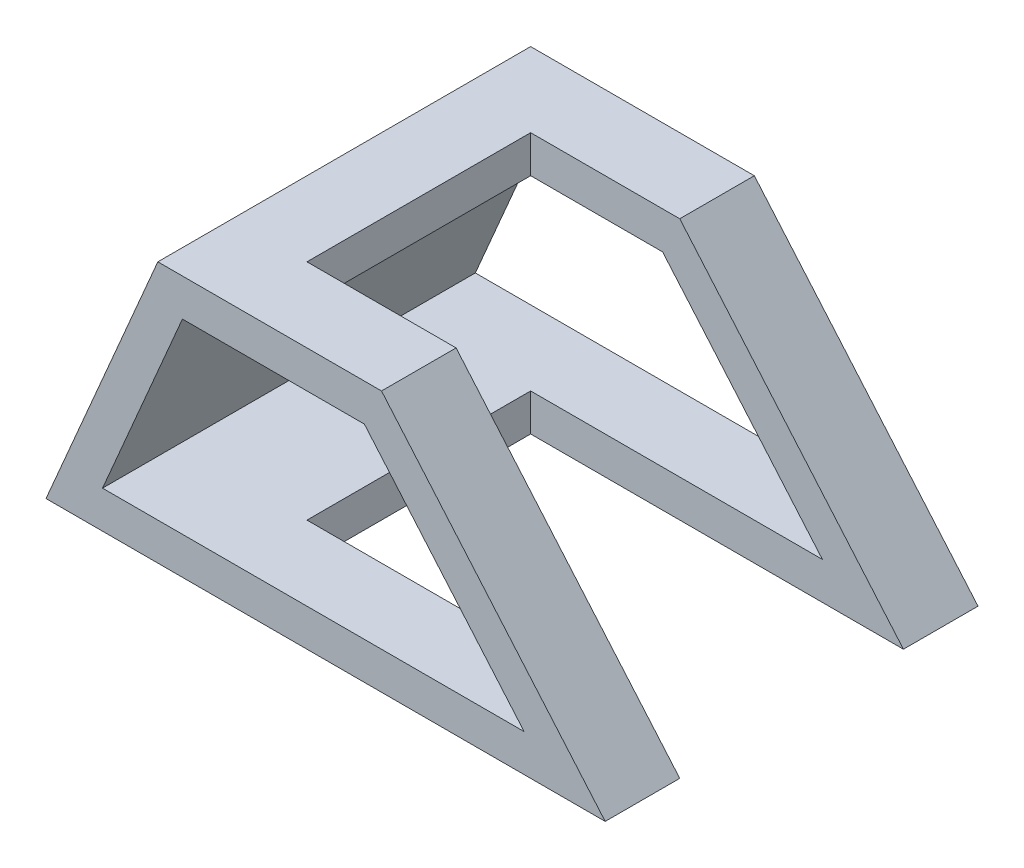
ISO-10303-21;
HEADER;
FILE_DESCRIPTION(('STEP AP214'),'2;1');
FILE_NAME('part.step','',(''),(''),'','','');
FILE_SCHEMA(('AUTOMOTIVE_DESIGN { 1 0 10303 214 1 1 1 1 }'));
ENDSEC;
DATA;
#1=APPLICATION_CONTEXT('core data for automotive mechanical design processes');
#2=APPLICATION_PROTOCOL_DEFINITION('international standard','automotive_design',2000,#1);
#3=PRODUCT_CONTEXT('',#1,'mechanical');
#4=PRODUCT('Part','Part','',(#3));
#5=PRODUCT_RELATED_PRODUCT_CATEGORY('part','',(#4));
#6=PRODUCT_DEFINITION_FORMATION('','',#4);
#7=PRODUCT_DEFINITION_CONTEXT('part definition',#1,'design');
#8=PRODUCT_DEFINITION('design','',#6,#7);
#9=PRODUCT_DEFINITION_SHAPE('','',#8);
#10=(LENGTH_UNIT() NAMED_UNIT(*) SI_UNIT(.MILLI.,.METRE.));
#11=(NAMED_UNIT(*) PLANE_ANGLE_UNIT() SI_UNIT($,.RADIAN.));
#12=(NAMED_UNIT(*) SI_UNIT($,.STERADIAN.) SOLID_ANGLE_UNIT());
#13=UNCERTAINTY_MEASURE_WITH_UNIT(LENGTH_MEASURE(1.E-05),#10,'distance_accuracy_value','');
#14=(GEOMETRIC_REPRESENTATION_CONTEXT(3) GLOBAL_UNCERTAINTY_ASSIGNED_CONTEXT((#13)) GLOBAL_UNIT_ASSIGNED_CONTEXT((#10,
#11,#12)) REPRESENTATION_CONTEXT('',''));
#15=CARTESIAN_POINT('',(0.,0.,0.));
#16=DIRECTION('',(0.,0.,1.));
#17=DIRECTION('',(1.,0.,0.));
#18=AXIS2_PLACEMENT_3D('',#15,#16,#17);
#19=CARTESIAN_POINT('',(74.5812028096597,0.,100.));
#20=DIRECTION('',(-0.759256602365297,-0.650791373455968,0.));
#21=DIRECTION('',(0.650791373455968,-0.759256602365297,0.));
#22=AXIS2_PLACEMENT_3D('',#19,#20,#21);
#23=PLANE('',#22);
#24=DIRECTION('',(0.,0.,-1.));
#25=VECTOR('',#24,1.);
#26=CARTESIAN_POINT('',(74.5812028096597,0.,100.));
#27=LINE('',#26,#25);
#28=CARTESIAN_POINT('',(74.5812028096597,0.,100.));
#29=VERTEX_POINT('',#28);
#30=CARTESIAN_POINT('',(74.5812028096598,0.,80.));
#31=VERTEX_POINT('',#30);
#32=EDGE_CURVE('E292',#29,#31,#27,.T.);
#33=ORIENTED_EDGE('',*,*,#32,.T.);
#34=DIRECTION('',(-0.650791373455968,0.759256602365297,0.));
#35=VECTOR('',#34,1.);
#36=CARTESIAN_POINT('',(74.5812028096597,0.,80.));
#37=LINE('',#36,#35);
#38=CARTESIAN_POINT('',(14.5812028096597,70.,80.));
#39=VERTEX_POINT('',#38);
#40=EDGE_CURVE('E206',#31,#39,#37,.T.);
#41=ORIENTED_EDGE('',*,*,#40,.T.);
#42=DIRECTION('',(0.,0.,-1.));
#43=VECTOR('',#42,1.);
#44=CARTESIAN_POINT('',(14.5812028096597,70.,100.));
#45=LINE('',#44,#43);
#46=CARTESIAN_POINT('',(14.5812028096597,70.,100.));
#47=VERTEX_POINT('',#46);
#48=EDGE_CURVE('E288',#47,#39,#45,.T.);
#49=ORIENTED_EDGE('',*,*,#48,.F.);
#50=DIRECTION('',(-0.650791373455968,0.759256602365297,0.));
#51=VECTOR('',#50,1.);
#52=CARTESIAN_POINT('',(74.5812028096597,0.,100.));
#53=LINE('',#52,#51);
#54=EDGE_CURVE('E264',#29,#47,#53,.T.);
#55=ORIENTED_EDGE('',*,*,#54,.F.);
#56=EDGE_LOOP('',(#33,#41,#49,#55));
#57=FACE_BOUND('',#56,.T.);
#58=ADVANCED_FACE('F39',(#57),#23,.F.);
#59=CARTESIAN_POINT('',(52.8389964420984,10.,100.));
#60=DIRECTION('',(-0.759256602365297,-0.650791373455968,0.));
#61=DIRECTION('',(0.650791373455968,-0.759256602365297,0.));
#62=AXIS2_PLACEMENT_3D('',#59,#60,#61);
#63=PLANE('',#62);
#64=DIRECTION('',(-0.650791373455968,0.759256602365297,0.));
#65=VECTOR('',#64,1.);
#66=CARTESIAN_POINT('',(52.8389964420984,10.,80.));
#67=LINE('',#66,#65);
#68=CARTESIAN_POINT('',(52.8389964420984,10.,80.));
#69=VERTEX_POINT('',#68);
#70=CARTESIAN_POINT('',(9.9818535849556,60.,80.));
#71=VERTEX_POINT('',#70);
#72=EDGE_CURVE('E200',#69,#71,#67,.T.);
#73=ORIENTED_EDGE('',*,*,#72,.F.);
#74=DIRECTION('',(0.,0.,-1.));
#75=VECTOR('',#74,1.);
#76=CARTESIAN_POINT('',(52.8389964420984,10.,100.));
#77=LINE('',#76,#75);
#78=CARTESIAN_POINT('',(52.8389964420984,10.,100.));
#79=VERTEX_POINT('',#78);
#80=EDGE_CURVE('E240',#79,#69,#77,.T.);
#81=ORIENTED_EDGE('',*,*,#80,.F.);
#82=DIRECTION('',(-0.650791373455968,0.759256602365297,0.));
#83=VECTOR('',#82,1.);
#84=CARTESIAN_POINT('',(52.8389964420984,10.,100.));
#85=LINE('',#84,#83);
#86=CARTESIAN_POINT('',(9.98185358495559,60.,100.));
#87=VERTEX_POINT('',#86);
#88=EDGE_CURVE('E211',#79,#87,#85,.T.);
#89=ORIENTED_EDGE('',*,*,#88,.T.);
#90=DIRECTION('',(0.,0.,-1.));
#91=VECTOR('',#90,1.);
#92=CARTESIAN_POINT('',(9.98185358495559,60.,100.));
#93=LINE('',#92,#91);
#94=EDGE_CURVE('E251',#87,#71,#93,.T.);
#95=ORIENTED_EDGE('',*,*,#94,.T.);
#96=EDGE_LOOP('',(#73,#81,#89,#95));
#97=FACE_BOUND('',#96,.T.);
#98=ADVANCED_FACE('F320',(#97),#63,.T.);
#99=CARTESIAN_POINT('',(0.,0.,100.));
#100=DIRECTION('',(0.,0.,1.));
#101=DIRECTION('',(1.,0.,0.));
#102=AXIS2_PLACEMENT_3D('',#99,#100,#101);
#103=PLANE('',#102);
#104=DIRECTION('',(-0.393919298579168,-0.919145030018058,0.));
#105=VECTOR('',#104,1.);
#106=CARTESIAN_POINT('',(-45.4187971903403,70.,100.));
#107=LINE('',#106,#105);
#108=CARTESIAN_POINT('',(-45.4187971903403,70.,100.));
#109=VERTEX_POINT('',#108);
#110=CARTESIAN_POINT('',(-75.4187971903403,0.,100.));
#111=VERTEX_POINT('',#110);
#112=EDGE_CURVE('E256',#109,#111,#107,.T.);
#113=ORIENTED_EDGE('',*,*,#112,.T.);
#114=DIRECTION('',(1.,0.,0.));
#115=VECTOR('',#114,1.);
#116=CARTESIAN_POINT('',(-75.4187971903403,0.,100.));
#117=LINE('',#116,#115);
#118=EDGE_CURVE('E260',#111,#29,#117,.T.);
#119=ORIENTED_EDGE('',*,*,#118,.T.);
#120=ORIENTED_EDGE('',*,*,#54,.T.);
#121=DIRECTION('',(-1.,0.,0.));
#122=VECTOR('',#121,1.);
#123=CARTESIAN_POINT('',(14.5812028096597,70.,100.));
#124=LINE('',#123,#122);
#125=EDGE_CURVE('E267',#47,#109,#124,.T.);
#126=ORIENTED_EDGE('',*,*,#125,.T.);
#127=EDGE_LOOP('',(#113,#119,#120,#126));
#128=FACE_BOUND('',#127,.T.);
#129=DIRECTION('',(-1.,0.,0.));
#130=VECTOR('',#129,1.);
#131=CARTESIAN_POINT('',(9.98185358495559,60.,100.));
#132=LINE('',#131,#130);
#133=CARTESIAN_POINT('',(-38.8248356105347,60.,100.));
#134=VERTEX_POINT('',#133);
#135=EDGE_CURVE('E214',#87,#134,#132,.T.);
#136=ORIENTED_EDGE('',*,*,#135,.F.);
#137=ORIENTED_EDGE('',*,*,#88,.F.);
#138=DIRECTION('',(1.,0.,0.));
#139=VECTOR('',#138,1.);
#140=CARTESIAN_POINT('',(-60.2534070391061,10.,100.));
#141=LINE('',#140,#139);
#142=CARTESIAN_POINT('',(-60.2534070391061,10.,100.));
#143=VERTEX_POINT('',#142);
#144=EDGE_CURVE('E222',#143,#79,#141,.T.);
#145=ORIENTED_EDGE('',*,*,#144,.F.);
#146=DIRECTION('',(-0.393919298579167,-0.919145030018058,0.));
#147=VECTOR('',#146,1.);
#148=CARTESIAN_POINT('',(-38.8248356105347,60.,100.));
#149=LINE('',#148,#147);
#150=EDGE_CURVE('E218',#134,#143,#149,.T.);
#151=ORIENTED_EDGE('',*,*,#150,.F.);
#152=EDGE_LOOP('',(#136,#137,#145,#151));
#153=FACE_BOUND('',#152,.T.);
#154=ADVANCED_FACE('F324',(#128,#153),#103,.T.);
#155=CARTESIAN_POINT('',(0.,0.,0.));
#156=DIRECTION('',(0.,0.,1.));
#157=DIRECTION('',(1.,0.,0.));
#158=AXIS2_PLACEMENT_3D('',#155,#156,#157);
#159=PLANE('',#158);
#160=DIRECTION('',(-0.393919298579168,-0.919145030018058,0.));
#161=VECTOR('',#160,1.);
#162=CARTESIAN_POINT('',(-45.4187971903403,70.,0.));
#163=LINE('',#162,#161);
#164=CARTESIAN_POINT('',(-45.4187971903403,70.,0.));
#165=VERTEX_POINT('',#164);
#166=CARTESIAN_POINT('',(-75.4187971903403,0.,0.));
#167=VERTEX_POINT('',#166);
#168=EDGE_CURVE('E255',#165,#167,#163,.T.);
#169=ORIENTED_EDGE('',*,*,#168,.F.);
#170=DIRECTION('',(-1.,0.,0.));
#171=VECTOR('',#170,1.);
#172=CARTESIAN_POINT('',(14.5812028096597,70.,0.));
#173=LINE('',#172,#171);
#174=CARTESIAN_POINT('',(14.5812028096597,70.,0.));
#175=VERTEX_POINT('',#174);
#176=EDGE_CURVE('E261',#175,#165,#173,.T.);
#177=ORIENTED_EDGE('',*,*,#176,.F.);
#178=DIRECTION('',(-0.650791373455968,0.759256602365297,0.));
#179=VECTOR('',#178,1.);
#180=CARTESIAN_POINT('',(74.5812028096597,0.,0.));
#181=LINE('',#180,#179);
#182=CARTESIAN_POINT('',(74.5812028096597,0.,0.));
#183=VERTEX_POINT('',#182);
#184=EDGE_CURVE('E278',#183,#175,#181,.T.);
#185=ORIENTED_EDGE('',*,*,#184,.F.);
#186=DIRECTION('',(1.,0.,0.));
#187=VECTOR('',#186,1.);
#188=CARTESIAN_POINT('',(-75.4187971903403,0.,0.));
#189=LINE('',#188,#187);
#190=EDGE_CURVE('E274',#167,#183,#189,.T.);
#191=ORIENTED_EDGE('',*,*,#190,.F.);
#192=EDGE_LOOP('',(#169,#177,#185,#191));
#193=FACE_BOUND('',#192,.T.);
#194=DIRECTION('',(-0.650791373455968,0.759256602365297,0.));
#195=VECTOR('',#194,1.);
#196=CARTESIAN_POINT('',(52.8389964420984,10.,0.));
#197=LINE('',#196,#195);
#198=CARTESIAN_POINT('',(52.8389964420984,10.,0.));
#199=VERTEX_POINT('',#198);
#200=CARTESIAN_POINT('',(9.98185358495559,60.,0.));
#201=VERTEX_POINT('',#200);
#202=EDGE_CURVE('E210',#199,#201,#197,.T.);
#203=ORIENTED_EDGE('',*,*,#202,.T.);
#204=DIRECTION('',(-1.,0.,0.));
#205=VECTOR('',#204,1.);
#206=CARTESIAN_POINT('',(9.98185358495559,60.,0.));
#207=LINE('',#206,#205);
#208=CARTESIAN_POINT('',(-38.8248356105347,60.,0.));
#209=VERTEX_POINT('',#208);
#210=EDGE_CURVE('E229',#201,#209,#207,.T.);
#211=ORIENTED_EDGE('',*,*,#210,.T.);
#212=DIRECTION('',(-0.393919298579167,-0.919145030018058,0.));
#213=VECTOR('',#212,1.);
#214=CARTESIAN_POINT('',(-38.8248356105347,60.,0.));
#215=LINE('',#214,#213);
#216=CARTESIAN_POINT('',(-60.2534070391061,10.,0.));
#217=VERTEX_POINT('',#216);
#218=EDGE_CURVE('E233',#209,#217,#215,.T.);
#219=ORIENTED_EDGE('',*,*,#218,.T.);
#220=DIRECTION('',(1.,0.,0.));
#221=VECTOR('',#220,1.);
#222=CARTESIAN_POINT('',(-60.2534070391061,10.,0.));
#223=LINE('',#222,#221);
#224=EDGE_CURVE('E215',#217,#199,#223,.T.);
#225=ORIENTED_EDGE('',*,*,#224,.T.);
#226=EDGE_LOOP('',(#203,#211,#219,#225));
#227=FACE_BOUND('',#226,.T.);
#228=ADVANCED_FACE('F336',(#193,#227),#159,.F.);
#229=CARTESIAN_POINT('',(-45.4187971903403,70.,100.));
#230=DIRECTION('',(0.919145030018058,-0.393919298579168,0.));
#231=DIRECTION('',(0.393919298579168,0.919145030018058,0.));
#232=AXIS2_PLACEMENT_3D('',#229,#230,#231);
#233=PLANE('',#232);
#234=ORIENTED_EDGE('',*,*,#168,.T.);
#235=DIRECTION('',(0.,0.,-1.));
#236=VECTOR('',#235,1.);
#237=CARTESIAN_POINT('',(-75.4187971903403,0.,100.));
#238=LINE('',#237,#236);
#239=EDGE_CURVE('E296',#111,#167,#238,.T.);
#240=ORIENTED_EDGE('',*,*,#239,.F.);
#241=ORIENTED_EDGE('',*,*,#112,.F.);
#242=DIRECTION('',(0.,0.,-1.));
#243=VECTOR('',#242,1.);
#244=CARTESIAN_POINT('',(-45.4187971903403,70.,100.));
#245=LINE('',#244,#243);
#246=EDGE_CURVE('E270',#109,#165,#245,.T.);
#247=ORIENTED_EDGE('',*,*,#246,.T.);
#248=EDGE_LOOP('',(#234,#240,#241,#247));
#249=FACE_BOUND('',#248,.T.);
#250=ADVANCED_FACE('F41',(#249),#233,.F.);
#251=CARTESIAN_POINT('',(-75.4187971903403,0.,100.));
#252=DIRECTION('',(0.,1.,0.));
#253=DIRECTION('',(0.,0.,1.));
#254=AXIS2_PLACEMENT_3D('',#251,#252,#253);
#255=PLANE('',#254);
#256=DIRECTION('',(0.,0.,-1.));
#257=VECTOR('',#256,1.);
#258=CARTESIAN_POINT('',(-25.4187971903403,0.,20.));
#259=LINE('',#258,#257);
#260=CARTESIAN_POINT('',(-25.4187971903403,0.,80.));
#261=VERTEX_POINT('',#260);
#262=CARTESIAN_POINT('',(-25.4187971903403,0.,20.));
#263=VERTEX_POINT('',#262);
#264=EDGE_CURVE('E182',#261,#263,#259,.T.);
#265=ORIENTED_EDGE('',*,*,#264,.F.);
#266=DIRECTION('',(-1.,0.,0.));
#267=VECTOR('',#266,1.);
#268=CARTESIAN_POINT('',(-25.4187971903402,0.,80.));
#269=LINE('',#268,#267);
#270=EDGE_CURVE('E190',#31,#261,#269,.T.);
#271=ORIENTED_EDGE('',*,*,#270,.F.);
#272=ORIENTED_EDGE('',*,*,#32,.F.);
#273=ORIENTED_EDGE('',*,*,#118,.F.);
#274=ORIENTED_EDGE('',*,*,#239,.T.);
#275=ORIENTED_EDGE('',*,*,#190,.T.);
#276=CARTESIAN_POINT('',(74.5812028096598,0.,20.));
#277=VERTEX_POINT('',#276);
#278=EDGE_CURVE('E291',#277,#183,#27,.T.);
#279=ORIENTED_EDGE('',*,*,#278,.F.);
#280=DIRECTION('',(1.,0.,0.));
#281=VECTOR('',#280,1.);
#282=CARTESIAN_POINT('',(-25.4187971903402,0.,20.));
#283=LINE('',#282,#281);
#284=EDGE_CURVE('E187',#263,#277,#283,.T.);
#285=ORIENTED_EDGE('',*,*,#284,.F.);
#286=EDGE_LOOP('',(#265,#271,#272,#273,#274,#275,#279,#285));
#287=FACE_BOUND('',#286,.T.);
#288=ADVANCED_FACE('F356',(#287),#255,.F.);
#289=CARTESIAN_POINT('',(14.5812028096597,70.,20.));
#290=VERTEX_POINT('',#289);
#291=EDGE_CURVE('E287',#290,#175,#45,.T.);
#292=ORIENTED_EDGE('',*,*,#291,.F.);
#293=DIRECTION('',(0.650791373455968,-0.759256602365297,0.));
#294=VECTOR('',#293,1.);
#295=CARTESIAN_POINT('',(74.5812028096597,0.,20.));
#296=LINE('',#295,#294);
#297=EDGE_CURVE('E55',#290,#277,#296,.T.);
#298=ORIENTED_EDGE('',*,*,#297,.T.);
#299=ORIENTED_EDGE('',*,*,#278,.T.);
#300=ORIENTED_EDGE('',*,*,#184,.T.);
#301=EDGE_LOOP('',(#292,#298,#299,#300));
#302=FACE_BOUND('',#301,.T.);
#303=ADVANCED_FACE('F368',(#302),#23,.F.);
#304=CARTESIAN_POINT('',(14.5812028096597,70.,100.));
#305=DIRECTION('',(0.,-1.,0.));
#306=DIRECTION('',(1.,0.,0.));
#307=AXIS2_PLACEMENT_3D('',#304,#305,#306);
#308=PLANE('',#307);
#309=ORIENTED_EDGE('',*,*,#48,.T.);
#310=DIRECTION('',(1.,0.,0.));
#311=VECTOR('',#310,1.);
#312=CARTESIAN_POINT('',(-25.4187971903403,70.,80.));
#313=LINE('',#312,#311);
#314=CARTESIAN_POINT('',(-25.4187971903403,70.,80.));
#315=VERTEX_POINT('',#314);
#316=EDGE_CURVE('E169',#315,#39,#313,.T.);
#317=ORIENTED_EDGE('',*,*,#316,.F.);
#318=DIRECTION('',(0.,0.,1.));
#319=VECTOR('',#318,1.);
#320=CARTESIAN_POINT('',(-25.4187971903403,70.,20.));
#321=LINE('',#320,#319);
#322=CARTESIAN_POINT('',(-25.4187971903403,70.,20.));
#323=VERTEX_POINT('',#322);
#324=EDGE_CURVE('E158',#323,#315,#321,.T.);
#325=ORIENTED_EDGE('',*,*,#324,.F.);
#326=DIRECTION('',(-1.,0.,0.));
#327=VECTOR('',#326,1.);
#328=CARTESIAN_POINT('',(-25.4187971903403,70.,20.));
#329=LINE('',#328,#327);
#330=EDGE_CURVE('E149',#290,#323,#329,.T.);
#331=ORIENTED_EDGE('',*,*,#330,.F.);
#332=ORIENTED_EDGE('',*,*,#291,.T.);
#333=ORIENTED_EDGE('',*,*,#176,.T.);
#334=ORIENTED_EDGE('',*,*,#246,.F.);
#335=ORIENTED_EDGE('',*,*,#125,.F.);
#336=EDGE_LOOP('',(#309,#317,#325,#331,#332,#333,#334,#335));
#337=FACE_BOUND('',#336,.T.);
#338=ADVANCED_FACE('F172',(#337),#308,.F.);
#339=DIRECTION('',(0.650791373455968,-0.759256602365297,0.));
#340=VECTOR('',#339,1.);
#341=CARTESIAN_POINT('',(52.8389964420984,10.,20.));
#342=LINE('',#341,#340);
#343=CARTESIAN_POINT('',(9.9818535849556,60.,20.));
#344=VERTEX_POINT('',#343);
#345=CARTESIAN_POINT('',(52.8389964420984,10.,20.));
#346=VERTEX_POINT('',#345);
#347=EDGE_CURVE('E62',#344,#346,#342,.T.);
#348=ORIENTED_EDGE('',*,*,#347,.F.);
#349=EDGE_CURVE('E250',#344,#201,#93,.T.);
#350=ORIENTED_EDGE('',*,*,#349,.T.);
#351=ORIENTED_EDGE('',*,*,#202,.F.);
#352=EDGE_CURVE('E225',#346,#199,#77,.T.);
#353=ORIENTED_EDGE('',*,*,#352,.F.);
#354=EDGE_LOOP('',(#348,#350,#351,#353));
#355=FACE_BOUND('',#354,.T.);
#356=ADVANCED_FACE('F360',(#355),#63,.T.);
#357=CARTESIAN_POINT('',(9.98185358495559,60.,100.));
#358=DIRECTION('',(0.,-1.,0.));
#359=DIRECTION('',(0.,0.,-1.));
#360=AXIS2_PLACEMENT_3D('',#357,#358,#359);
#361=PLANE('',#360);
#362=DIRECTION('',(-1.,0.,0.));
#363=VECTOR('',#362,1.);
#364=CARTESIAN_POINT('',(9.98185358495559,60.,80.));
#365=LINE('',#364,#363);
#366=CARTESIAN_POINT('',(-25.4187971903403,60.,80.));
#367=VERTEX_POINT('',#366);
#368=EDGE_CURVE('E203',#71,#367,#365,.T.);
#369=ORIENTED_EDGE('',*,*,#368,.F.);
#370=ORIENTED_EDGE('',*,*,#94,.F.);
#371=ORIENTED_EDGE('',*,*,#135,.T.);
#372=DIRECTION('',(0.,0.,-1.));
#373=VECTOR('',#372,1.);
#374=CARTESIAN_POINT('',(-38.8248356105347,60.,100.));
#375=LINE('',#374,#373);
#376=EDGE_CURVE('E247',#134,#209,#375,.T.);
#377=ORIENTED_EDGE('',*,*,#376,.T.);
#378=ORIENTED_EDGE('',*,*,#210,.F.);
#379=ORIENTED_EDGE('',*,*,#349,.F.);
#380=DIRECTION('',(1.,0.,0.));
#381=VECTOR('',#380,1.);
#382=CARTESIAN_POINT('',(9.98185358495559,60.,20.));
#383=LINE('',#382,#381);
#384=CARTESIAN_POINT('',(-25.4187971903403,60.,20.));
#385=VERTEX_POINT('',#384);
#386=EDGE_CURVE('E193',#385,#344,#383,.T.);
#387=ORIENTED_EDGE('',*,*,#386,.F.);
#388=DIRECTION('',(0.,0.,-1.));
#389=VECTOR('',#388,1.);
#390=CARTESIAN_POINT('',(-25.4187971903403,60.,100.));
#391=LINE('',#390,#389);
#392=EDGE_CURVE('E166',#367,#385,#391,.T.);
#393=ORIENTED_EDGE('',*,*,#392,.F.);
#394=EDGE_LOOP('',(#369,#370,#371,#377,#378,#379,#387,#393));
#395=FACE_BOUND('',#394,.T.);
#396=ADVANCED_FACE('F329',(#395),#361,.T.);
#397=CARTESIAN_POINT('',(-38.8248356105347,60.,100.));
#398=DIRECTION('',(0.919145030018058,-0.393919298579167,0.));
#399=DIRECTION('',(0.393919298579167,0.919145030018058,0.));
#400=AXIS2_PLACEMENT_3D('',#397,#398,#399);
#401=PLANE('',#400);
#402=ORIENTED_EDGE('',*,*,#218,.F.);
#403=ORIENTED_EDGE('',*,*,#376,.F.);
#404=ORIENTED_EDGE('',*,*,#150,.T.);
#405=DIRECTION('',(0.,0.,-1.));
#406=VECTOR('',#405,1.);
#407=CARTESIAN_POINT('',(-60.2534070391061,10.,100.));
#408=LINE('',#407,#406);
#409=EDGE_CURVE('E244',#143,#217,#408,.T.);
#410=ORIENTED_EDGE('',*,*,#409,.T.);
#411=EDGE_LOOP('',(#402,#403,#404,#410));
#412=FACE_BOUND('',#411,.T.);
#413=ADVANCED_FACE('F333',(#412),#401,.T.);
#414=CARTESIAN_POINT('',(-60.2534070391061,10.,100.));
#415=DIRECTION('',(0.,1.,0.));
#416=DIRECTION('',(-1.,0.,0.));
#417=AXIS2_PLACEMENT_3D('',#414,#415,#416);
#418=PLANE('',#417);
#419=DIRECTION('',(1.,0.,0.));
#420=VECTOR('',#419,1.);
#421=CARTESIAN_POINT('',(-60.2534070391061,10.,80.));
#422=LINE('',#421,#420);
#423=CARTESIAN_POINT('',(-25.4187971903403,9.99999999999995,80.));
#424=VERTEX_POINT('',#423);
#425=EDGE_CURVE('E11',#424,#69,#422,.T.);
#426=ORIENTED_EDGE('',*,*,#425,.F.);
#427=DIRECTION('',(0.,0.,1.));
#428=VECTOR('',#427,1.);
#429=CARTESIAN_POINT('',(-25.4187971903403,10.,100.));
#430=LINE('',#429,#428);
#431=CARTESIAN_POINT('',(-25.4187971903403,9.99999999999995,20.));
#432=VERTEX_POINT('',#431);
#433=EDGE_CURVE('E48',#432,#424,#430,.T.);
#434=ORIENTED_EDGE('',*,*,#433,.F.);
#435=DIRECTION('',(-1.,0.,0.));
#436=VECTOR('',#435,1.);
#437=CARTESIAN_POINT('',(-60.2534070391061,10.,20.));
#438=LINE('',#437,#436);
#439=EDGE_CURVE('E300',#346,#432,#438,.T.);
#440=ORIENTED_EDGE('',*,*,#439,.F.);
#441=ORIENTED_EDGE('',*,*,#352,.T.);
#442=ORIENTED_EDGE('',*,*,#224,.F.);
#443=ORIENTED_EDGE('',*,*,#409,.F.);
#444=ORIENTED_EDGE('',*,*,#144,.T.);
#445=ORIENTED_EDGE('',*,*,#80,.T.);
#446=EDGE_LOOP('',(#426,#434,#440,#441,#442,#443,#444,#445));
#447=FACE_BOUND('',#446,.T.);
#448=ADVANCED_FACE('F315',(#447),#418,.T.);
#449=CARTESIAN_POINT('',(-25.4187971903402,-116.619037896906,80.));
#450=DIRECTION('',(0.,0.,1.));
#451=DIRECTION('',(1.,0.,0.));
#452=AXIS2_PLACEMENT_3D('',#449,#450,#451);
#453=PLANE('',#452);
#454=ORIENTED_EDGE('',*,*,#270,.T.);
#455=DIRECTION('',(0.,1.,0.));
#456=VECTOR('',#455,1.);
#457=CARTESIAN_POINT('',(-25.4187971903402,-116.619037896906,80.));
#458=LINE('',#457,#456);
#459=EDGE_CURVE('E179',#261,#424,#458,.T.);
#460=ORIENTED_EDGE('',*,*,#459,.T.);
#461=ORIENTED_EDGE('',*,*,#425,.T.);
#462=ORIENTED_EDGE('',*,*,#72,.T.);
#463=ORIENTED_EDGE('',*,*,#368,.T.);
#464=EDGE_CURVE('E183',#367,#315,#458,.T.);
#465=ORIENTED_EDGE('',*,*,#464,.T.);
#466=ORIENTED_EDGE('',*,*,#316,.T.);
#467=ORIENTED_EDGE('',*,*,#40,.F.);
#468=EDGE_LOOP('',(#454,#460,#461,#462,#463,#465,#466,#467));
#469=FACE_BOUND('',#468,.T.);
#470=ADVANCED_FACE('F312',(#469),#453,.F.);
#471=CARTESIAN_POINT('',(-25.4187971903402,-116.619037896906,20.));
#472=DIRECTION('',(-1.,0.,0.));
#473=DIRECTION('',(0.,-1.,0.));
#474=AXIS2_PLACEMENT_3D('',#471,#472,#473);
#475=PLANE('',#474);
#476=ORIENTED_EDGE('',*,*,#392,.T.);
#477=DIRECTION('',(0.,1.,0.));
#478=VECTOR('',#477,1.);
#479=CARTESIAN_POINT('',(-25.4187971903402,-116.619037896906,20.));
#480=LINE('',#479,#478);
#481=EDGE_CURVE('E152',#385,#323,#480,.T.);
#482=ORIENTED_EDGE('',*,*,#481,.T.);
#483=ORIENTED_EDGE('',*,*,#324,.T.);
#484=ORIENTED_EDGE('',*,*,#464,.F.);
#485=EDGE_LOOP('',(#476,#482,#483,#484));
#486=FACE_BOUND('',#485,.T.);
#487=ADVANCED_FACE('F162',(#486),#475,.F.);
#488=CARTESIAN_POINT('',(-25.4187971903402,-116.619037896906,20.));
#489=DIRECTION('',(0.,0.,-1.));
#490=DIRECTION('',(-1.,0.,0.));
#491=AXIS2_PLACEMENT_3D('',#488,#489,#490);
#492=PLANE('',#491);
#493=ORIENTED_EDGE('',*,*,#330,.T.);
#494=ORIENTED_EDGE('',*,*,#481,.F.);
#495=ORIENTED_EDGE('',*,*,#386,.T.);
#496=ORIENTED_EDGE('',*,*,#347,.T.);
#497=ORIENTED_EDGE('',*,*,#439,.T.);
#498=EDGE_CURVE('E168',#263,#432,#480,.T.);
#499=ORIENTED_EDGE('',*,*,#498,.F.);
#500=ORIENTED_EDGE('',*,*,#284,.T.);
#501=ORIENTED_EDGE('',*,*,#297,.F.);
#502=EDGE_LOOP('',(#493,#494,#495,#496,#497,#499,#500,#501));
#503=FACE_BOUND('',#502,.T.);
#504=ADVANCED_FACE('F151',(#503),#492,.F.);
#505=ORIENTED_EDGE('',*,*,#433,.T.);
#506=ORIENTED_EDGE('',*,*,#459,.F.);
#507=ORIENTED_EDGE('',*,*,#264,.T.);
#508=ORIENTED_EDGE('',*,*,#498,.T.);
#509=EDGE_LOOP('',(#505,#506,#507,#508));
#510=FACE_BOUND('',#509,.T.);
#511=ADVANCED_FACE('F306',(#510),#475,.F.);
#512=CLOSED_SHELL('',(#58,#98,#154,#228,#250,#288,#303,#338,#356,#396,#413,#448,#470,#487,#504,#511));
#513=MANIFOLD_SOLID_BREP('B2',#512);
#514=ADVANCED_BREP_SHAPE_REPRESENTATION('',(#18,#513),#14);
#515=SHAPE_DEFINITION_REPRESENTATION(#9,#514);
ENDSEC;
END-ISO-10303-21;
